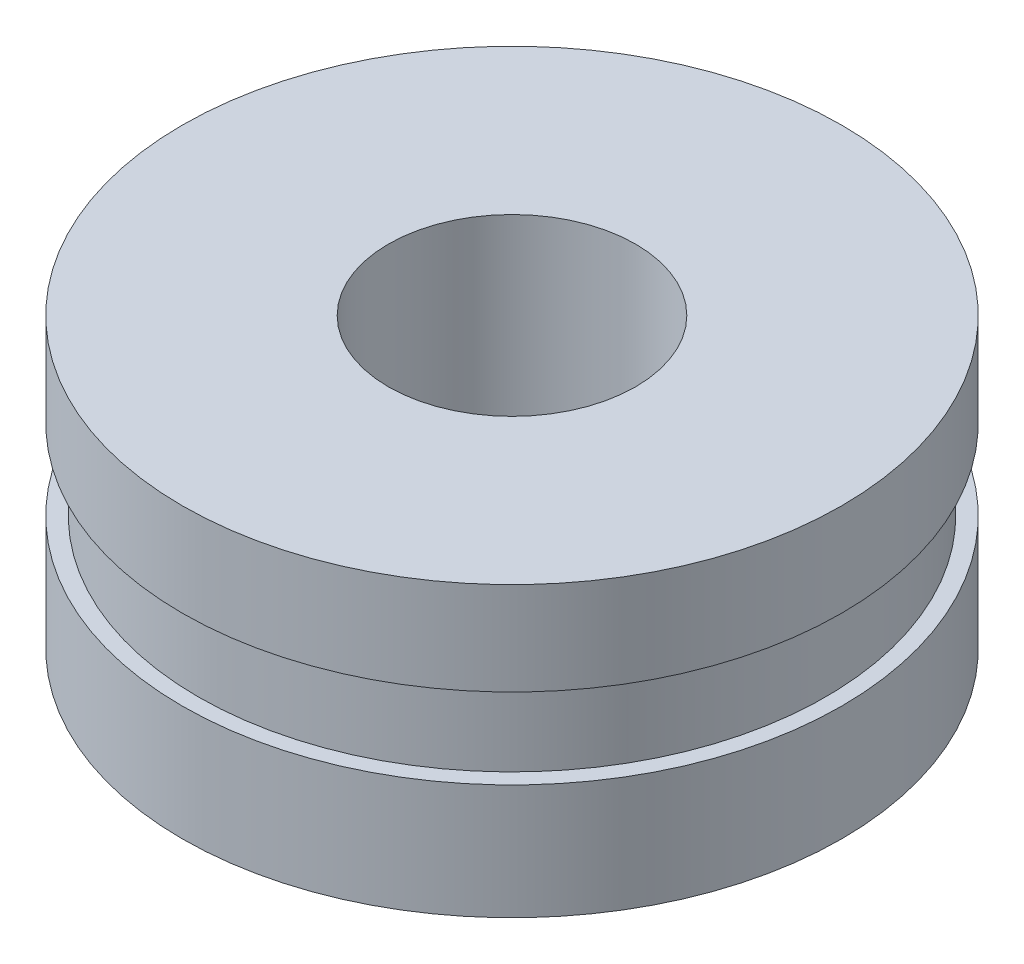
ISO-10303-21;
HEADER;
FILE_DESCRIPTION(('STEP AP214'),'2;1');
FILE_NAME('part.step','',(''),(''),'','','');
FILE_SCHEMA(('AUTOMOTIVE_DESIGN { 1 0 10303 214 1 1 1 1 }'));
ENDSEC;
DATA;
#1=APPLICATION_CONTEXT('core data for automotive mechanical design processes');
#2=APPLICATION_PROTOCOL_DEFINITION('international standard','automotive_design',2000,#1);
#3=PRODUCT_CONTEXT('',#1,'mechanical');
#4=PRODUCT('Part','Part','',(#3));
#5=PRODUCT_RELATED_PRODUCT_CATEGORY('part','',(#4));
#6=PRODUCT_DEFINITION_FORMATION('','',#4);
#7=PRODUCT_DEFINITION_CONTEXT('part definition',#1,'design');
#8=PRODUCT_DEFINITION('design','',#6,#7);
#9=PRODUCT_DEFINITION_SHAPE('','',#8);
#10=(LENGTH_UNIT() NAMED_UNIT(*) SI_UNIT(.MILLI.,.METRE.));
#11=(NAMED_UNIT(*) PLANE_ANGLE_UNIT() SI_UNIT($,.RADIAN.));
#12=(NAMED_UNIT(*) SI_UNIT($,.STERADIAN.) SOLID_ANGLE_UNIT());
#13=UNCERTAINTY_MEASURE_WITH_UNIT(LENGTH_MEASURE(1.E-05),#10,'distance_accuracy_value','');
#14=(GEOMETRIC_REPRESENTATION_CONTEXT(3) GLOBAL_UNCERTAINTY_ASSIGNED_CONTEXT((#13)) GLOBAL_UNIT_ASSIGNED_CONTEXT((#10,
#11,#12)) REPRESENTATION_CONTEXT('',''));
#15=CARTESIAN_POINT('',(0.,0.,0.));
#16=DIRECTION('',(0.,0.,1.));
#17=DIRECTION('',(1.,0.,0.));
#18=AXIS2_PLACEMENT_3D('',#15,#16,#17);
#19=CARTESIAN_POINT('',(0.,3.5,0.));
#20=DIRECTION('',(0.,-1.,0.));
#21=DIRECTION('',(0.,0.,-1.));
#22=AXIS2_PLACEMENT_3D('',#19,#20,#21);
#23=CYLINDRICAL_SURFACE('',#22,4.);
#24=CARTESIAN_POINT('',(0.,2.37132795063131,0.));
#25=DIRECTION('',(0.,1.,0.));
#26=DIRECTION('',(0.,0.,1.));
#27=AXIS2_PLACEMENT_3D('',#24,#25,#26);
#28=CIRCLE('',#27,4.);
#29=CARTESIAN_POINT('',(0.,2.37132795063131,4.));
#30=VERTEX_POINT('',#29);
#31=EDGE_CURVE('E49',#30,#30,#28,.T.);
#32=ORIENTED_EDGE('',*,*,#31,.T.);
#33=EDGE_LOOP('',(#32));
#34=FACE_BOUND('',#33,.T.);
#35=CARTESIAN_POINT('',(0.,3.5,0.));
#36=DIRECTION('',(0.,1.,0.));
#37=DIRECTION('',(0.,0.,1.));
#38=AXIS2_PLACEMENT_3D('',#35,#36,#37);
#39=CIRCLE('',#38,4.);
#40=CARTESIAN_POINT('',(0.,3.5,4.));
#41=VERTEX_POINT('',#40);
#42=EDGE_CURVE('E10',#41,#41,#39,.T.);
#43=ORIENTED_EDGE('',*,*,#42,.F.);
#44=EDGE_LOOP('',(#43));
#45=FACE_BOUND('',#44,.T.);
#46=ADVANCED_FACE('F33',(#34,#45),#23,.T.);
#47=CARTESIAN_POINT('',(0.,3.5,0.));
#48=DIRECTION('',(0.,1.,0.));
#49=DIRECTION('',(0.,0.,1.));
#50=AXIS2_PLACEMENT_3D('',#47,#48,#49);
#51=PLANE('',#50);
#52=ORIENTED_EDGE('',*,*,#42,.T.);
#53=EDGE_LOOP('',(#52));
#54=FACE_BOUND('',#53,.T.);
#55=CARTESIAN_POINT('',(0.,3.5,0.));
#56=DIRECTION('',(0.,1.,0.));
#57=DIRECTION('',(0.,0.,1.));
#58=AXIS2_PLACEMENT_3D('',#55,#56,#57);
#59=CIRCLE('',#58,1.5);
#60=CARTESIAN_POINT('',(0.,3.5,1.5));
#61=VERTEX_POINT('',#60);
#62=EDGE_CURVE('E44',#61,#61,#59,.T.);
#63=ORIENTED_EDGE('',*,*,#62,.F.);
#64=EDGE_LOOP('',(#63));
#65=FACE_BOUND('',#64,.T.);
#66=ADVANCED_FACE('F74',(#54,#65),#51,.T.);
#67=CARTESIAN_POINT('',(0.,0.,0.));
#68=DIRECTION('',(0.,1.,0.));
#69=DIRECTION('',(0.,0.,1.));
#70=AXIS2_PLACEMENT_3D('',#67,#68,#69);
#71=PLANE('',#70);
#72=CARTESIAN_POINT('',(0.,0.,0.));
#73=DIRECTION('',(0.,1.,0.));
#74=DIRECTION('',(0.,0.,1.));
#75=AXIS2_PLACEMENT_3D('',#72,#73,#74);
#76=CIRCLE('',#75,4.);
#77=CARTESIAN_POINT('',(0.,0.,4.));
#78=VERTEX_POINT('',#77);
#79=EDGE_CURVE('E37',#78,#78,#76,.T.);
#80=ORIENTED_EDGE('',*,*,#79,.F.);
#81=EDGE_LOOP('',(#80));
#82=FACE_BOUND('',#81,.T.);
#83=CARTESIAN_POINT('',(0.,0.,0.));
#84=DIRECTION('',(0.,1.,0.));
#85=DIRECTION('',(0.,0.,1.));
#86=AXIS2_PLACEMENT_3D('',#83,#84,#85);
#87=CIRCLE('',#86,1.5);
#88=CARTESIAN_POINT('',(0.,0.,1.5));
#89=VERTEX_POINT('',#88);
#90=EDGE_CURVE('E46',#89,#89,#87,.T.);
#91=ORIENTED_EDGE('',*,*,#90,.T.);
#92=EDGE_LOOP('',(#91));
#93=FACE_BOUND('',#92,.T.);
#94=ADVANCED_FACE('F69',(#82,#93),#71,.F.);
#95=CARTESIAN_POINT('',(0.,1.39538843793237,0.));
#96=DIRECTION('',(0.,1.,0.));
#97=DIRECTION('',(0.,0.,1.));
#98=AXIS2_PLACEMENT_3D('',#95,#96,#97);
#99=CIRCLE('',#98,4.);
#100=CARTESIAN_POINT('',(0.,1.39538843793237,4.));
#101=VERTEX_POINT('',#100);
#102=EDGE_CURVE('E60',#101,#101,#99,.T.);
#103=ORIENTED_EDGE('',*,*,#102,.F.);
#104=EDGE_LOOP('',(#103));
#105=FACE_BOUND('',#104,.T.);
#106=ORIENTED_EDGE('',*,*,#79,.T.);
#107=EDGE_LOOP('',(#106));
#108=FACE_BOUND('',#107,.T.);
#109=ADVANCED_FACE('F35',(#105,#108),#23,.T.);
#110=CARTESIAN_POINT('',(0.,3.5,0.));
#111=DIRECTION('',(0.,-1.,0.));
#112=DIRECTION('',(0.,0.,-1.));
#113=AXIS2_PLACEMENT_3D('',#110,#111,#112);
#114=CYLINDRICAL_SURFACE('',#113,1.5);
#115=ORIENTED_EDGE('',*,*,#62,.T.);
#116=EDGE_LOOP('',(#115));
#117=FACE_BOUND('',#116,.T.);
#118=ORIENTED_EDGE('',*,*,#90,.F.);
#119=EDGE_LOOP('',(#118));
#120=FACE_BOUND('',#119,.T.);
#121=ADVANCED_FACE('F68',(#117,#120),#114,.F.);
#122=CARTESIAN_POINT('',(-4.,2.37132795063131,0.));
#123=DIRECTION('',(0.,1.,0.));
#124=DIRECTION('',(0.,0.,1.));
#125=AXIS2_PLACEMENT_3D('',#122,#123,#124);
#126=PLANE('',#125);
#127=ORIENTED_EDGE('',*,*,#31,.F.);
#128=EDGE_LOOP('',(#127));
#129=FACE_BOUND('',#128,.T.);
#130=CARTESIAN_POINT('',(0.,2.37132795063131,0.));
#131=DIRECTION('',(0.,1.,0.));
#132=DIRECTION('',(0.,0.,1.));
#133=AXIS2_PLACEMENT_3D('',#130,#131,#132);
#134=CIRCLE('',#133,3.80677027313625);
#135=CARTESIAN_POINT('',(0.,2.37132795063131,3.80677027313625));
#136=VERTEX_POINT('',#135);
#137=EDGE_CURVE('E54',#136,#136,#134,.T.);
#138=ORIENTED_EDGE('',*,*,#137,.T.);
#139=EDGE_LOOP('',(#138));
#140=FACE_BOUND('',#139,.T.);
#141=ADVANCED_FACE('F78',(#129,#140),#126,.F.);
#142=CARTESIAN_POINT('',(0.,3.5,0.));
#143=DIRECTION('',(0.,1.,0.));
#144=DIRECTION('',(0.,0.,1.));
#145=AXIS2_PLACEMENT_3D('',#142,#143,#144);
#146=CYLINDRICAL_SURFACE('',#145,3.80677027313625);
#147=ORIENTED_EDGE('',*,*,#137,.F.);
#148=EDGE_LOOP('',(#147));
#149=FACE_BOUND('',#148,.T.);
#150=CARTESIAN_POINT('',(0.,1.39538843793237,0.));
#151=DIRECTION('',(0.,1.,0.));
#152=DIRECTION('',(0.,0.,1.));
#153=AXIS2_PLACEMENT_3D('',#150,#151,#152);
#154=CIRCLE('',#153,3.80677027313625);
#155=CARTESIAN_POINT('',(0.,1.39538843793237,3.80677027313625));
#156=VERTEX_POINT('',#155);
#157=EDGE_CURVE('E57',#156,#156,#154,.T.);
#158=ORIENTED_EDGE('',*,*,#157,.T.);
#159=EDGE_LOOP('',(#158));
#160=FACE_BOUND('',#159,.T.);
#161=ADVANCED_FACE('F84',(#149,#160),#146,.T.);
#162=CARTESIAN_POINT('',(-3.80677027313625,1.39538843793237,0.));
#163=DIRECTION('',(0.,-1.,0.));
#164=DIRECTION('',(0.,0.,-1.));
#165=AXIS2_PLACEMENT_3D('',#162,#163,#164);
#166=PLANE('',#165);
#167=ORIENTED_EDGE('',*,*,#157,.F.);
#168=EDGE_LOOP('',(#167));
#169=FACE_BOUND('',#168,.T.);
#170=ORIENTED_EDGE('',*,*,#102,.T.);
#171=EDGE_LOOP('',(#170));
#172=FACE_BOUND('',#171,.T.);
#173=ADVANCED_FACE('F64',(#169,#172),#166,.F.);
#174=CLOSED_SHELL('',(#46,#66,#94,#109,#121,#141,#161,#173));
#175=MANIFOLD_SOLID_BREP('B2',#174);
#176=ADVANCED_BREP_SHAPE_REPRESENTATION('',(#18,#175),#14);
#177=SHAPE_DEFINITION_REPRESENTATION(#9,#176);
ENDSEC;
END-ISO-10303-21;
